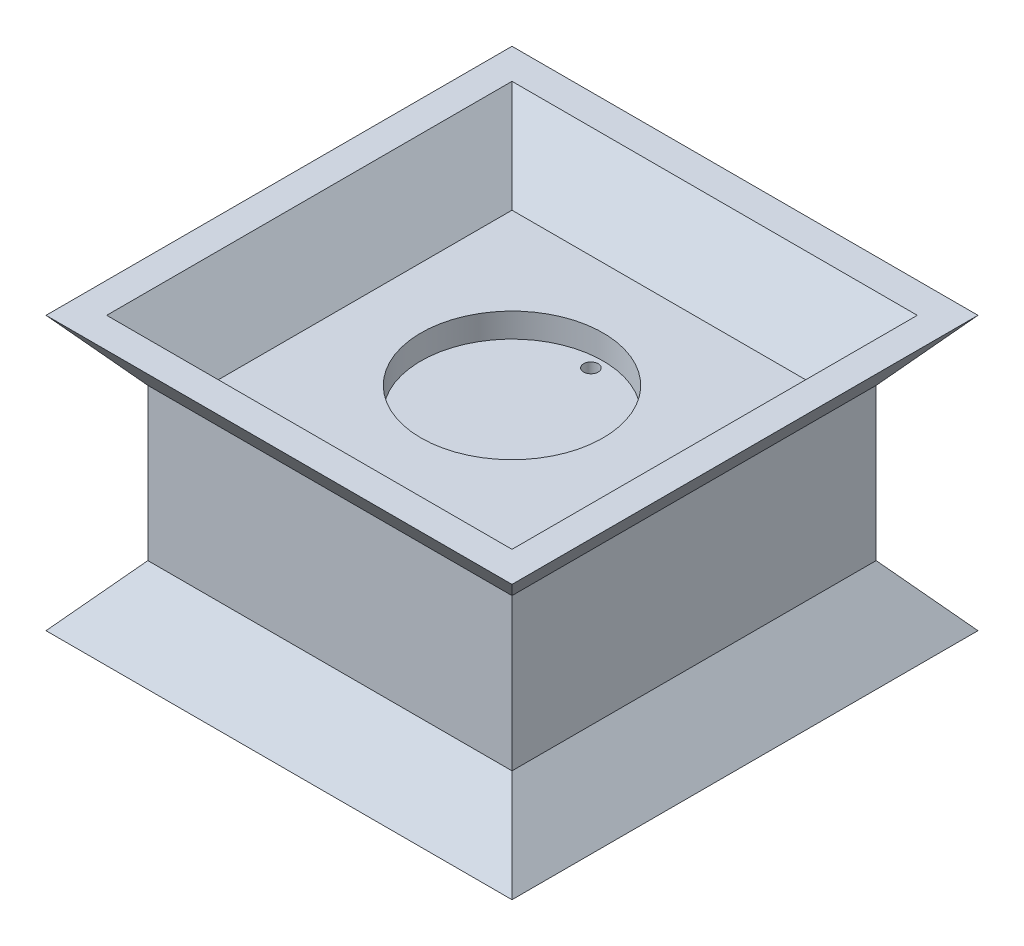
ISO-10303-21;
HEADER;
FILE_DESCRIPTION(('STEP AP214'),'2;1');
FILE_NAME('part.step','',(''),(''),'','','');
FILE_SCHEMA(('AUTOMOTIVE_DESIGN { 1 0 10303 214 1 1 1 1 }'));
ENDSEC;
DATA;
#1=APPLICATION_CONTEXT('core data for automotive mechanical design processes');
#2=APPLICATION_PROTOCOL_DEFINITION('international standard','automotive_design',2000,#1);
#3=PRODUCT_CONTEXT('',#1,'mechanical');
#4=PRODUCT('Part','Part','',(#3));
#5=PRODUCT_RELATED_PRODUCT_CATEGORY('part','',(#4));
#6=PRODUCT_DEFINITION_FORMATION('','',#4);
#7=PRODUCT_DEFINITION_CONTEXT('part definition',#1,'design');
#8=PRODUCT_DEFINITION('design','',#6,#7);
#9=PRODUCT_DEFINITION_SHAPE('','',#8);
#10=(LENGTH_UNIT() NAMED_UNIT(*) SI_UNIT(.MILLI.,.METRE.));
#11=(NAMED_UNIT(*) PLANE_ANGLE_UNIT() SI_UNIT($,.RADIAN.));
#12=(NAMED_UNIT(*) SI_UNIT($,.STERADIAN.) SOLID_ANGLE_UNIT());
#13=UNCERTAINTY_MEASURE_WITH_UNIT(LENGTH_MEASURE(1.E-05),#10,'distance_accuracy_value','');
#14=(GEOMETRIC_REPRESENTATION_CONTEXT(3) GLOBAL_UNCERTAINTY_ASSIGNED_CONTEXT((#13)) GLOBAL_UNIT_ASSIGNED_CONTEXT((#10,
#11,#12)) REPRESENTATION_CONTEXT('',''));
#15=CARTESIAN_POINT('',(0.,0.,0.));
#16=DIRECTION('',(0.,0.,1.));
#17=DIRECTION('',(1.,0.,0.));
#18=AXIS2_PLACEMENT_3D('',#15,#16,#17);
#19=CARTESIAN_POINT('',(38.1,15.875,38.1));
#20=DIRECTION('',(-1.,0.,0.));
#21=DIRECTION('',(0.,0.,1.));
#22=AXIS2_PLACEMENT_3D('',#19,#20,#21);
#23=PLANE('',#22);
#24=DIRECTION('',(0.,0.,-1.));
#25=VECTOR('',#24,1.);
#26=CARTESIAN_POINT('',(38.1,-15.875,38.1));
#27=LINE('',#26,#25);
#28=CARTESIAN_POINT('',(38.1,-15.875,38.1));
#29=VERTEX_POINT('',#28);
#30=CARTESIAN_POINT('',(38.1,-15.875,-38.1));
#31=VERTEX_POINT('',#30);
#32=EDGE_CURVE('E193',#29,#31,#27,.T.);
#33=ORIENTED_EDGE('',*,*,#32,.T.);
#34=DIRECTION('',(0.,-1.,0.));
#35=VECTOR('',#34,1.);
#36=CARTESIAN_POINT('',(38.1,15.875,-38.1));
#37=LINE('',#36,#35);
#38=CARTESIAN_POINT('',(38.1,15.875,-38.1));
#39=VERTEX_POINT('',#38);
#40=EDGE_CURVE('E11',#39,#31,#37,.T.);
#41=ORIENTED_EDGE('',*,*,#40,.F.);
#42=DIRECTION('',(0.,0.,-1.));
#43=VECTOR('',#42,1.);
#44=CARTESIAN_POINT('',(38.1,15.875,38.1));
#45=LINE('',#44,#43);
#46=CARTESIAN_POINT('',(38.1,15.875,38.1));
#47=VERTEX_POINT('',#46);
#48=EDGE_CURVE('E209',#47,#39,#45,.T.);
#49=ORIENTED_EDGE('',*,*,#48,.F.);
#50=DIRECTION('',(0.,-1.,0.));
#51=VECTOR('',#50,1.);
#52=CARTESIAN_POINT('',(38.1,15.875,38.1));
#53=LINE('',#52,#51);
#54=EDGE_CURVE('E222',#47,#29,#53,.T.);
#55=ORIENTED_EDGE('',*,*,#54,.T.);
#56=EDGE_LOOP('',(#33,#41,#49,#55));
#57=FACE_BOUND('',#56,.T.);
#58=ADVANCED_FACE('F32',(#57),#23,.F.);
#59=CARTESIAN_POINT('',(-38.1,15.875,-38.1));
#60=DIRECTION('',(0.,0.,1.));
#61=DIRECTION('',(1.,0.,0.));
#62=AXIS2_PLACEMENT_3D('',#59,#60,#61);
#63=PLANE('',#62);
#64=DIRECTION('',(-1.,0.,0.));
#65=VECTOR('',#64,1.);
#66=CARTESIAN_POINT('',(-38.1,-15.875,-38.1));
#67=LINE('',#66,#65);
#68=CARTESIAN_POINT('',(-38.1,-15.875,-38.1));
#69=VERTEX_POINT('',#68);
#70=EDGE_CURVE('E225',#31,#69,#67,.T.);
#71=ORIENTED_EDGE('',*,*,#70,.T.);
#72=DIRECTION('',(0.,-1.,0.));
#73=VECTOR('',#72,1.);
#74=CARTESIAN_POINT('',(-38.1,15.875,-38.1));
#75=LINE('',#74,#73);
#76=CARTESIAN_POINT('',(-38.1,15.875,-38.1));
#77=VERTEX_POINT('',#76);
#78=EDGE_CURVE('E39',#77,#69,#75,.T.);
#79=ORIENTED_EDGE('',*,*,#78,.F.);
#80=DIRECTION('',(-1.,0.,0.));
#81=VECTOR('',#80,1.);
#82=CARTESIAN_POINT('',(-38.1,15.875,-38.1));
#83=LINE('',#82,#81);
#84=EDGE_CURVE('E212',#39,#77,#83,.T.);
#85=ORIENTED_EDGE('',*,*,#84,.F.);
#86=ORIENTED_EDGE('',*,*,#40,.T.);
#87=EDGE_LOOP('',(#71,#79,#85,#86));
#88=FACE_BOUND('',#87,.T.);
#89=ADVANCED_FACE('F236',(#88),#63,.F.);
#90=CARTESIAN_POINT('',(-38.1,15.875,38.1));
#91=DIRECTION('',(1.,0.,0.));
#92=DIRECTION('',(0.,0.,-1.));
#93=AXIS2_PLACEMENT_3D('',#90,#91,#92);
#94=PLANE('',#93);
#95=DIRECTION('',(0.,0.,1.));
#96=VECTOR('',#95,1.);
#97=CARTESIAN_POINT('',(-38.1,-15.875,38.1));
#98=LINE('',#97,#96);
#99=CARTESIAN_POINT('',(-38.1,-15.875,38.1));
#100=VERTEX_POINT('',#99);
#101=EDGE_CURVE('E67',#69,#100,#98,.T.);
#102=ORIENTED_EDGE('',*,*,#101,.T.);
#103=DIRECTION('',(0.,-1.,0.));
#104=VECTOR('',#103,1.);
#105=CARTESIAN_POINT('',(-38.1,15.875,38.1));
#106=LINE('',#105,#104);
#107=CARTESIAN_POINT('',(-38.1,15.875,38.1));
#108=VERTEX_POINT('',#107);
#109=EDGE_CURVE('E55',#108,#100,#106,.T.);
#110=ORIENTED_EDGE('',*,*,#109,.F.);
#111=DIRECTION('',(0.,0.,1.));
#112=VECTOR('',#111,1.);
#113=CARTESIAN_POINT('',(-38.1,15.875,38.1));
#114=LINE('',#113,#112);
#115=EDGE_CURVE('E216',#77,#108,#114,.T.);
#116=ORIENTED_EDGE('',*,*,#115,.F.);
#117=ORIENTED_EDGE('',*,*,#78,.T.);
#118=EDGE_LOOP('',(#102,#110,#116,#117));
#119=FACE_BOUND('',#118,.T.);
#120=ADVANCED_FACE('F234',(#119),#94,.F.);
#121=CARTESIAN_POINT('',(-38.1,15.875,38.1));
#122=DIRECTION('',(0.,0.,-1.));
#123=DIRECTION('',(-1.,0.,0.));
#124=AXIS2_PLACEMENT_3D('',#121,#122,#123);
#125=PLANE('',#124);
#126=DIRECTION('',(1.,0.,0.));
#127=VECTOR('',#126,1.);
#128=CARTESIAN_POINT('',(-38.1,-15.875,38.1));
#129=LINE('',#128,#127);
#130=EDGE_CURVE('E213',#100,#29,#129,.T.);
#131=ORIENTED_EDGE('',*,*,#130,.T.);
#132=ORIENTED_EDGE('',*,*,#54,.F.);
#133=DIRECTION('',(1.,0.,0.));
#134=VECTOR('',#133,1.);
#135=CARTESIAN_POINT('',(-38.1,15.875,38.1));
#136=LINE('',#135,#134);
#137=EDGE_CURVE('E219',#108,#47,#136,.T.);
#138=ORIENTED_EDGE('',*,*,#137,.F.);
#139=ORIENTED_EDGE('',*,*,#109,.T.);
#140=EDGE_LOOP('',(#131,#132,#138,#139));
#141=FACE_BOUND('',#140,.T.);
#142=ADVANCED_FACE('F254',(#141),#125,.F.);
#143=CARTESIAN_POINT('',(-38.1,15.875,-38.1));
#144=DIRECTION('',(-0.766044443118977,-0.64278760968654,0.));
#145=DIRECTION('',(0.642787609686541,-0.766044443118977,0.));
#146=AXIS2_PLACEMENT_3D('',#143,#144,#145);
#147=PLANE('',#146);
#148=ORIENTED_EDGE('',*,*,#115,.T.);
#149=DIRECTION('',(0.540716203060937,-0.644400477571771,-0.540716203060937));
#150=VECTOR('',#149,1.);
#151=CARTESIAN_POINT('',(-38.1,15.875,38.1));
#152=LINE('',#151,#150);
#153=CARTESIAN_POINT('',(-48.7565653159515,28.575,48.7565653159515));
#154=VERTEX_POINT('',#153);
#155=EDGE_CURVE('E190',#154,#108,#152,.T.);
#156=ORIENTED_EDGE('',*,*,#155,.F.);
#157=DIRECTION('',(0.,0.,-1.));
#158=VECTOR('',#157,1.);
#159=CARTESIAN_POINT('',(-48.7565653159515,28.575,-38.1));
#160=LINE('',#159,#158);
#161=CARTESIAN_POINT('',(-48.7565653159515,28.575,-48.7565653159515));
#162=VERTEX_POINT('',#161);
#163=EDGE_CURVE('E172',#162,#154,#160,.F.);
#164=ORIENTED_EDGE('',*,*,#163,.F.);
#165=DIRECTION('',(0.540716203060937,-0.644400477571771,0.540716203060937));
#166=VECTOR('',#165,1.);
#167=CARTESIAN_POINT('',(-38.1,15.875,-38.1));
#168=LINE('',#167,#166);
#169=EDGE_CURVE('E195',#162,#77,#168,.T.);
#170=ORIENTED_EDGE('',*,*,#169,.T.);
#171=EDGE_LOOP('',(#148,#156,#164,#170));
#172=FACE_BOUND('',#171,.T.);
#173=ADVANCED_FACE('F266',(#172),#147,.T.);
#174=CARTESIAN_POINT('',(-38.1,15.875,38.1));
#175=DIRECTION('',(0.,-0.64278760968654,0.766044443118977));
#176=DIRECTION('',(0.,-0.766044443118977,-0.64278760968654));
#177=AXIS2_PLACEMENT_3D('',#174,#175,#176);
#178=PLANE('',#177);
#179=ORIENTED_EDGE('',*,*,#137,.T.);
#180=DIRECTION('',(-0.540716203060937,-0.644400477571771,-0.540716203060937));
#181=VECTOR('',#180,1.);
#182=CARTESIAN_POINT('',(15.821100266349,-10.6759587966246,15.8211002663491));
#183=LINE('',#182,#181);
#184=CARTESIAN_POINT('',(48.7565653159515,28.575,48.7565653159515));
#185=VERTEX_POINT('',#184);
#186=EDGE_CURVE('E194',#185,#47,#183,.T.);
#187=ORIENTED_EDGE('',*,*,#186,.F.);
#188=DIRECTION('',(-1.,0.,0.));
#189=VECTOR('',#188,1.);
#190=CARTESIAN_POINT('',(-38.1,28.575,48.7565653159515));
#191=LINE('',#190,#189);
#192=EDGE_CURVE('E204',#154,#185,#191,.F.);
#193=ORIENTED_EDGE('',*,*,#192,.F.);
#194=ORIENTED_EDGE('',*,*,#155,.T.);
#195=EDGE_LOOP('',(#179,#187,#193,#194));
#196=FACE_BOUND('',#195,.T.);
#197=ADVANCED_FACE('F268',(#196),#178,.T.);
#198=CARTESIAN_POINT('',(38.1,15.875,-38.1));
#199=DIRECTION('',(0.766044443118977,-0.64278760968654,0.));
#200=DIRECTION('',(0.642787609686541,0.766044443118977,0.));
#201=AXIS2_PLACEMENT_3D('',#198,#199,#200);
#202=PLANE('',#201);
#203=ORIENTED_EDGE('',*,*,#48,.T.);
#204=DIRECTION('',(-0.540716203060937,-0.644400477571771,0.540716203060937));
#205=VECTOR('',#204,1.);
#206=CARTESIAN_POINT('',(15.821100266349,-10.6759587966246,-15.8211002663491));
#207=LINE('',#206,#205);
#208=CARTESIAN_POINT('',(48.7565653159515,28.575,-48.7565653159515));
#209=VERTEX_POINT('',#208);
#210=EDGE_CURVE('E198',#209,#39,#207,.T.);
#211=ORIENTED_EDGE('',*,*,#210,.F.);
#212=DIRECTION('',(0.,0.,1.));
#213=VECTOR('',#212,1.);
#214=CARTESIAN_POINT('',(48.7565653159515,28.575,-38.1));
#215=LINE('',#214,#213);
#216=EDGE_CURVE('E206',#185,#209,#215,.F.);
#217=ORIENTED_EDGE('',*,*,#216,.F.);
#218=ORIENTED_EDGE('',*,*,#186,.T.);
#219=EDGE_LOOP('',(#203,#211,#217,#218));
#220=FACE_BOUND('',#219,.T.);
#221=ADVANCED_FACE('F258',(#220),#202,.T.);
#222=CARTESIAN_POINT('',(-38.1,15.875,-38.1));
#223=DIRECTION('',(0.,-0.64278760968654,-0.766044443118977));
#224=DIRECTION('',(0.,0.766044443118977,-0.64278760968654));
#225=AXIS2_PLACEMENT_3D('',#222,#223,#224);
#226=PLANE('',#225);
#227=ORIENTED_EDGE('',*,*,#84,.T.);
#228=ORIENTED_EDGE('',*,*,#169,.F.);
#229=DIRECTION('',(1.,0.,0.));
#230=VECTOR('',#229,1.);
#231=CARTESIAN_POINT('',(-38.1,28.575,-48.7565653159515));
#232=LINE('',#231,#230);
#233=EDGE_CURVE('E77',#209,#162,#232,.F.);
#234=ORIENTED_EDGE('',*,*,#233,.F.);
#235=ORIENTED_EDGE('',*,*,#210,.T.);
#236=EDGE_LOOP('',(#227,#228,#234,#235));
#237=FACE_BOUND('',#236,.T.);
#238=ADVANCED_FACE('F262',(#237),#226,.T.);
#239=CARTESIAN_POINT('',(0.,28.575,0.));
#240=DIRECTION('',(0.,1.,0.));
#241=DIRECTION('',(0.,0.,1.));
#242=AXIS2_PLACEMENT_3D('',#239,#240,#241);
#243=PLANE('',#242);
#244=DIRECTION('',(0.,0.,1.));
#245=VECTOR('',#244,1.);
#246=CARTESIAN_POINT('',(-42.4065653159515,28.575,42.4065653159515));
#247=LINE('',#246,#245);
#248=CARTESIAN_POINT('',(-42.4065653159515,28.575,-42.4065653159515));
#249=VERTEX_POINT('',#248);
#250=CARTESIAN_POINT('',(-42.4065653159515,28.575,42.4065653159515));
#251=VERTEX_POINT('',#250);
#252=EDGE_CURVE('E46',#249,#251,#247,.T.);
#253=ORIENTED_EDGE('',*,*,#252,.F.);
#254=DIRECTION('',(-1.,0.,0.));
#255=VECTOR('',#254,1.);
#256=CARTESIAN_POINT('',(42.4065653159515,28.575,-42.4065653159515));
#257=LINE('',#256,#255);
#258=CARTESIAN_POINT('',(42.4065653159515,28.575,-42.4065653159515));
#259=VERTEX_POINT('',#258);
#260=EDGE_CURVE('E151',#259,#249,#257,.T.);
#261=ORIENTED_EDGE('',*,*,#260,.F.);
#262=DIRECTION('',(0.,0.,-1.));
#263=VECTOR('',#262,1.);
#264=CARTESIAN_POINT('',(42.4065653159515,28.575,42.4065653159515));
#265=LINE('',#264,#263);
#266=CARTESIAN_POINT('',(42.4065653159515,28.575,42.4065653159515));
#267=VERTEX_POINT('',#266);
#268=EDGE_CURVE('E134',#267,#259,#265,.T.);
#269=ORIENTED_EDGE('',*,*,#268,.F.);
#270=DIRECTION('',(1.,0.,0.));
#271=VECTOR('',#270,1.);
#272=CARTESIAN_POINT('',(42.4065653159515,28.575,42.4065653159515));
#273=LINE('',#272,#271);
#274=EDGE_CURVE('E145',#251,#267,#273,.T.);
#275=ORIENTED_EDGE('',*,*,#274,.F.);
#276=EDGE_LOOP('',(#253,#261,#269,#275));
#277=FACE_BOUND('',#276,.T.);
#278=ORIENTED_EDGE('',*,*,#163,.T.);
#279=ORIENTED_EDGE('',*,*,#192,.T.);
#280=ORIENTED_EDGE('',*,*,#216,.T.);
#281=ORIENTED_EDGE('',*,*,#233,.T.);
#282=EDGE_LOOP('',(#278,#279,#280,#281));
#283=FACE_BOUND('',#282,.T.);
#284=ADVANCED_FACE('F149',(#277,#283),#243,.T.);
#285=CARTESIAN_POINT('',(-38.1,-15.875,-38.1));
#286=DIRECTION('',(-0.766044443118977,0.64278760968654,0.));
#287=DIRECTION('',(-0.642787609686541,-0.766044443118977,0.));
#288=AXIS2_PLACEMENT_3D('',#285,#286,#287);
#289=PLANE('',#288);
#290=ORIENTED_EDGE('',*,*,#101,.F.);
#291=DIRECTION('',(0.540716203060937,0.644400477571771,0.540716203060937));
#292=VECTOR('',#291,1.);
#293=CARTESIAN_POINT('',(-38.1,-15.875,-38.1));
#294=LINE('',#293,#292);
#295=CARTESIAN_POINT('',(-48.7565653159515,-28.575,-48.7565653159515));
#296=VERTEX_POINT('',#295);
#297=EDGE_CURVE('E170',#296,#69,#294,.T.);
#298=ORIENTED_EDGE('',*,*,#297,.F.);
#299=DIRECTION('',(0.,0.,1.));
#300=VECTOR('',#299,1.);
#301=CARTESIAN_POINT('',(-48.7565653159515,-28.575,-38.1));
#302=LINE('',#301,#300);
#303=CARTESIAN_POINT('',(-48.7565653159515,-28.575,48.7565653159515));
#304=VERTEX_POINT('',#303);
#305=EDGE_CURVE('E159',#296,#304,#302,.T.);
#306=ORIENTED_EDGE('',*,*,#305,.T.);
#307=DIRECTION('',(0.540716203060937,0.644400477571771,-0.540716203060937));
#308=VECTOR('',#307,1.);
#309=CARTESIAN_POINT('',(-15.8211002663491,10.6759587966246,15.8211002663491));
#310=LINE('',#309,#308);
#311=EDGE_CURVE('E174',#304,#100,#310,.T.);
#312=ORIENTED_EDGE('',*,*,#311,.T.);
#313=EDGE_LOOP('',(#290,#298,#306,#312));
#314=FACE_BOUND('',#313,.T.);
#315=ADVANCED_FACE('F243',(#314),#289,.T.);
#316=CARTESIAN_POINT('',(-38.1,-15.875,-38.1));
#317=DIRECTION('',(0.,0.64278760968654,-0.766044443118977));
#318=DIRECTION('',(0.,0.766044443118977,0.64278760968654));
#319=AXIS2_PLACEMENT_3D('',#316,#317,#318);
#320=PLANE('',#319);
#321=ORIENTED_EDGE('',*,*,#70,.F.);
#322=DIRECTION('',(-0.540716203060937,0.644400477571771,0.540716203060937));
#323=VECTOR('',#322,1.);
#324=CARTESIAN_POINT('',(38.1,-15.875,-38.1));
#325=LINE('',#324,#323);
#326=CARTESIAN_POINT('',(48.7565653159515,-28.575,-48.7565653159515));
#327=VERTEX_POINT('',#326);
#328=EDGE_CURVE('E173',#327,#31,#325,.T.);
#329=ORIENTED_EDGE('',*,*,#328,.F.);
#330=DIRECTION('',(-1.,0.,0.));
#331=VECTOR('',#330,1.);
#332=CARTESIAN_POINT('',(-38.1,-28.575,-48.7565653159515));
#333=LINE('',#332,#331);
#334=EDGE_CURVE('E182',#327,#296,#333,.T.);
#335=ORIENTED_EDGE('',*,*,#334,.T.);
#336=ORIENTED_EDGE('',*,*,#297,.T.);
#337=EDGE_LOOP('',(#321,#329,#335,#336));
#338=FACE_BOUND('',#337,.T.);
#339=ADVANCED_FACE('F240',(#338),#320,.T.);
#340=CARTESIAN_POINT('',(38.1,-15.875,-38.1));
#341=DIRECTION('',(0.766044443118977,0.64278760968654,0.));
#342=DIRECTION('',(-0.642787609686541,0.766044443118977,0.));
#343=AXIS2_PLACEMENT_3D('',#340,#341,#342);
#344=PLANE('',#343);
#345=ORIENTED_EDGE('',*,*,#32,.F.);
#346=DIRECTION('',(-0.540716203060937,0.644400477571771,-0.540716203060937));
#347=VECTOR('',#346,1.);
#348=CARTESIAN_POINT('',(15.821100266349,10.6759587966246,15.8211002663491));
#349=LINE('',#348,#347);
#350=CARTESIAN_POINT('',(48.7565653159515,-28.575,48.7565653159515));
#351=VERTEX_POINT('',#350);
#352=EDGE_CURVE('E176',#351,#29,#349,.T.);
#353=ORIENTED_EDGE('',*,*,#352,.F.);
#354=DIRECTION('',(0.,0.,-1.));
#355=VECTOR('',#354,1.);
#356=CARTESIAN_POINT('',(48.7565653159515,-28.575,-38.1));
#357=LINE('',#356,#355);
#358=EDGE_CURVE('E185',#351,#327,#357,.T.);
#359=ORIENTED_EDGE('',*,*,#358,.T.);
#360=ORIENTED_EDGE('',*,*,#328,.T.);
#361=EDGE_LOOP('',(#345,#353,#359,#360));
#362=FACE_BOUND('',#361,.T.);
#363=ADVANCED_FACE('F349',(#362),#344,.T.);
#364=CARTESIAN_POINT('',(-38.1,-15.875,38.1));
#365=DIRECTION('',(0.,0.64278760968654,0.766044443118977));
#366=DIRECTION('',(0.,-0.766044443118977,0.64278760968654));
#367=AXIS2_PLACEMENT_3D('',#364,#365,#366);
#368=PLANE('',#367);
#369=ORIENTED_EDGE('',*,*,#130,.F.);
#370=ORIENTED_EDGE('',*,*,#311,.F.);
#371=DIRECTION('',(1.,0.,0.));
#372=VECTOR('',#371,1.);
#373=CARTESIAN_POINT('',(-38.1,-28.575,48.7565653159515));
#374=LINE('',#373,#372);
#375=EDGE_CURVE('E177',#304,#351,#374,.T.);
#376=ORIENTED_EDGE('',*,*,#375,.T.);
#377=ORIENTED_EDGE('',*,*,#352,.T.);
#378=EDGE_LOOP('',(#369,#370,#376,#377));
#379=FACE_BOUND('',#378,.T.);
#380=ADVANCED_FACE('F250',(#379),#368,.T.);
#381=CARTESIAN_POINT('',(0.,-28.575,0.));
#382=DIRECTION('',(0.,-1.,0.));
#383=DIRECTION('',(0.,0.,1.));
#384=AXIS2_PLACEMENT_3D('',#381,#382,#383);
#385=PLANE('',#384);
#386=ORIENTED_EDGE('',*,*,#305,.F.);
#387=ORIENTED_EDGE('',*,*,#334,.F.);
#388=ORIENTED_EDGE('',*,*,#358,.F.);
#389=ORIENTED_EDGE('',*,*,#375,.F.);
#390=EDGE_LOOP('',(#386,#387,#388,#389));
#391=FACE_BOUND('',#390,.T.);
#392=ADVANCED_FACE('F246',(#391),#385,.T.);
#393=CARTESIAN_POINT('',(-42.4065653159515,28.575,42.4065653159515));
#394=DIRECTION('',(-0.766044443118977,-0.64278760968654,0.));
#395=DIRECTION('',(0.64278760968654,-0.766044443118977,0.));
#396=AXIS2_PLACEMENT_3D('',#393,#394,#395);
#397=PLANE('',#396);
#398=ORIENTED_EDGE('',*,*,#252,.T.);
#399=DIRECTION('',(-0.540716203060937,0.644400477571771,0.540716203060937));
#400=VECTOR('',#399,1.);
#401=CARTESIAN_POINT('',(-42.4065653159515,28.575,42.4065653159515));
#402=LINE('',#401,#400);
#403=CARTESIAN_POINT('',(-31.75,15.875,31.75));
#404=VERTEX_POINT('',#403);
#405=EDGE_CURVE('E142',#404,#251,#402,.T.);
#406=ORIENTED_EDGE('',*,*,#405,.F.);
#407=DIRECTION('',(0.,0.,1.));
#408=VECTOR('',#407,1.);
#409=CARTESIAN_POINT('',(-31.75,15.875,0.));
#410=LINE('',#409,#408);
#411=CARTESIAN_POINT('',(-31.75,15.875,-31.75));
#412=VERTEX_POINT('',#411);
#413=EDGE_CURVE('E153',#412,#404,#410,.T.);
#414=ORIENTED_EDGE('',*,*,#413,.F.);
#415=DIRECTION('',(-0.540716203060937,0.644400477571771,-0.540716203060937));
#416=VECTOR('',#415,1.);
#417=CARTESIAN_POINT('',(-17.609410021395,-0.977098908404153,-17.609410021395));
#418=LINE('',#417,#416);
#419=EDGE_CURVE('E157',#412,#249,#418,.T.);
#420=ORIENTED_EDGE('',*,*,#419,.T.);
#421=EDGE_LOOP('',(#398,#406,#414,#420));
#422=FACE_BOUND('',#421,.T.);
#423=ADVANCED_FACE('F368',(#422),#397,.F.);
#424=CARTESIAN_POINT('',(42.4065653159515,28.575,-42.4065653159515));
#425=DIRECTION('',(0.,-0.64278760968654,-0.766044443118977));
#426=DIRECTION('',(0.,0.766044443118977,-0.64278760968654));
#427=AXIS2_PLACEMENT_3D('',#424,#425,#426);
#428=PLANE('',#427);
#429=ORIENTED_EDGE('',*,*,#260,.T.);
#430=ORIENTED_EDGE('',*,*,#419,.F.);
#431=DIRECTION('',(-1.,0.,0.));
#432=VECTOR('',#431,1.);
#433=CARTESIAN_POINT('',(0.,15.875,-31.75));
#434=LINE('',#433,#432);
#435=CARTESIAN_POINT('',(31.75,15.875,-31.75));
#436=VERTEX_POINT('',#435);
#437=EDGE_CURVE('E160',#436,#412,#434,.T.);
#438=ORIENTED_EDGE('',*,*,#437,.F.);
#439=DIRECTION('',(0.540716203060937,0.644400477571771,-0.540716203060937));
#440=VECTOR('',#439,1.);
#441=CARTESIAN_POINT('',(17.609410021395,-0.97709890840416,-17.609410021395));
#442=LINE('',#441,#440);
#443=EDGE_CURVE('E141',#436,#259,#442,.T.);
#444=ORIENTED_EDGE('',*,*,#443,.T.);
#445=EDGE_LOOP('',(#429,#430,#438,#444));
#446=FACE_BOUND('',#445,.T.);
#447=ADVANCED_FACE('F374',(#446),#428,.F.);
#448=CARTESIAN_POINT('',(42.4065653159515,28.575,42.4065653159515));
#449=DIRECTION('',(0.766044443118977,-0.64278760968654,0.));
#450=DIRECTION('',(0.64278760968654,0.766044443118977,0.));
#451=AXIS2_PLACEMENT_3D('',#448,#449,#450);
#452=PLANE('',#451);
#453=ORIENTED_EDGE('',*,*,#268,.T.);
#454=ORIENTED_EDGE('',*,*,#443,.F.);
#455=DIRECTION('',(0.,0.,-1.));
#456=VECTOR('',#455,1.);
#457=CARTESIAN_POINT('',(31.75,15.875,0.));
#458=LINE('',#457,#456);
#459=CARTESIAN_POINT('',(31.75,15.875,31.75));
#460=VERTEX_POINT('',#459);
#461=EDGE_CURVE('E137',#460,#436,#458,.T.);
#462=ORIENTED_EDGE('',*,*,#461,.F.);
#463=DIRECTION('',(0.540716203060937,0.644400477571771,0.540716203060937));
#464=VECTOR('',#463,1.);
#465=CARTESIAN_POINT('',(42.4065653159515,28.575,42.4065653159515));
#466=LINE('',#465,#464);
#467=EDGE_CURVE('E130',#460,#267,#466,.T.);
#468=ORIENTED_EDGE('',*,*,#467,.T.);
#469=EDGE_LOOP('',(#453,#454,#462,#468));
#470=FACE_BOUND('',#469,.T.);
#471=ADVANCED_FACE('F132',(#470),#452,.F.);
#472=CARTESIAN_POINT('',(42.4065653159515,28.575,42.4065653159515));
#473=DIRECTION('',(0.,-0.64278760968654,0.766044443118977));
#474=DIRECTION('',(0.,-0.766044443118977,-0.64278760968654));
#475=AXIS2_PLACEMENT_3D('',#472,#473,#474);
#476=PLANE('',#475);
#477=ORIENTED_EDGE('',*,*,#274,.T.);
#478=ORIENTED_EDGE('',*,*,#467,.F.);
#479=DIRECTION('',(1.,0.,0.));
#480=VECTOR('',#479,1.);
#481=CARTESIAN_POINT('',(0.,15.875,31.75));
#482=LINE('',#481,#480);
#483=EDGE_CURVE('E165',#404,#460,#482,.T.);
#484=ORIENTED_EDGE('',*,*,#483,.F.);
#485=ORIENTED_EDGE('',*,*,#405,.T.);
#486=EDGE_LOOP('',(#477,#478,#484,#485));
#487=FACE_BOUND('',#486,.T.);
#488=ADVANCED_FACE('F146',(#487),#476,.F.);
#489=CARTESIAN_POINT('',(0.,15.875,0.));
#490=DIRECTION('',(0.,1.,0.));
#491=DIRECTION('',(0.,0.,1.));
#492=AXIS2_PLACEMENT_3D('',#489,#490,#491);
#493=PLANE('',#492);
#494=CARTESIAN_POINT('',(0.,15.875,0.));
#495=DIRECTION('',(0.,1.,0.));
#496=DIRECTION('',(0.,0.,1.));
#497=AXIS2_PLACEMENT_3D('',#494,#495,#496);
#498=CIRCLE('',#497,19.05);
#499=CARTESIAN_POINT('',(0.,15.875,19.05));
#500=VERTEX_POINT('',#499);
#501=EDGE_CURVE('E469',#500,#500,#498,.T.);
#502=ORIENTED_EDGE('',*,*,#501,.F.);
#503=EDGE_LOOP('',(#502));
#504=FACE_BOUND('',#503,.T.);
#505=ORIENTED_EDGE('',*,*,#413,.T.);
#506=ORIENTED_EDGE('',*,*,#483,.T.);
#507=ORIENTED_EDGE('',*,*,#461,.T.);
#508=ORIENTED_EDGE('',*,*,#437,.T.);
#509=EDGE_LOOP('',(#505,#506,#507,#508));
#510=FACE_BOUND('',#509,.T.);
#511=ADVANCED_FACE('F394',(#504,#510),#493,.T.);
#512=CARTESIAN_POINT('',(0.,10.795,0.));
#513=DIRECTION('',(0.,1.,0.));
#514=DIRECTION('',(0.,0.,1.));
#515=AXIS2_PLACEMENT_3D('',#512,#513,#514);
#516=CYLINDRICAL_SURFACE('',#515,19.05);
#517=CARTESIAN_POINT('',(0.,10.795,0.));
#518=DIRECTION('',(0.,1.,0.));
#519=DIRECTION('',(0.,0.,1.));
#520=AXIS2_PLACEMENT_3D('',#517,#518,#519);
#521=CIRCLE('',#520,19.05);
#522=CARTESIAN_POINT('',(0.,10.795,19.05));
#523=VERTEX_POINT('',#522);
#524=EDGE_CURVE('E473',#523,#523,#521,.T.);
#525=ORIENTED_EDGE('',*,*,#524,.F.);
#526=EDGE_LOOP('',(#525));
#527=FACE_BOUND('',#526,.T.);
#528=ORIENTED_EDGE('',*,*,#501,.T.);
#529=EDGE_LOOP('',(#528));
#530=FACE_BOUND('',#529,.T.);
#531=ADVANCED_FACE('F401',(#527,#530),#516,.F.);
#532=CARTESIAN_POINT('',(0.,10.795,0.));
#533=DIRECTION('',(0.,1.,0.));
#534=DIRECTION('',(0.,0.,1.));
#535=AXIS2_PLACEMENT_3D('',#532,#533,#534);
#536=PLANE('',#535);
#537=CARTESIAN_POINT('',(0.,10.795,-16.51));
#538=DIRECTION('',(0.,1.,0.));
#539=DIRECTION('',(0.,0.,1.));
#540=AXIS2_PLACEMENT_3D('',#537,#538,#539);
#541=CIRCLE('',#540,1.524);
#542=CARTESIAN_POINT('',(0.,10.795,-14.986));
#543=VERTEX_POINT('',#542);
#544=EDGE_CURVE('E470',#543,#543,#541,.T.);
#545=ORIENTED_EDGE('',*,*,#544,.F.);
#546=EDGE_LOOP('',(#545));
#547=FACE_BOUND('',#546,.T.);
#548=ORIENTED_EDGE('',*,*,#524,.T.);
#549=EDGE_LOOP('',(#548));
#550=FACE_BOUND('',#549,.T.);
#551=ADVANCED_FACE('F409',(#547,#550),#536,.T.);
#552=CARTESIAN_POINT('',(0.,-9.525,-16.51));
#553=DIRECTION('',(0.,1.,0.));
#554=DIRECTION('',(0.,0.,1.));
#555=AXIS2_PLACEMENT_3D('',#552,#553,#554);
#556=CYLINDRICAL_SURFACE('',#555,1.524);
#557=CARTESIAN_POINT('',(0.,-9.525,-16.51));
#558=DIRECTION('',(0.,1.,0.));
#559=DIRECTION('',(0.,0.,1.));
#560=AXIS2_PLACEMENT_3D('',#557,#558,#559);
#561=CIRCLE('',#560,1.524);
#562=CARTESIAN_POINT('',(0.,-9.525,-14.986));
#563=VERTEX_POINT('',#562);
#564=EDGE_CURVE('E468',#563,#563,#561,.T.);
#565=ORIENTED_EDGE('',*,*,#564,.F.);
#566=EDGE_LOOP('',(#565));
#567=FACE_BOUND('',#566,.T.);
#568=ORIENTED_EDGE('',*,*,#544,.T.);
#569=EDGE_LOOP('',(#568));
#570=FACE_BOUND('',#569,.T.);
#571=ADVANCED_FACE('F417',(#567,#570),#556,.F.);
#572=CARTESIAN_POINT('',(0.,-9.525,-16.51));
#573=DIRECTION('',(0.,1.,0.));
#574=DIRECTION('',(0.,0.,1.));
#575=AXIS2_PLACEMENT_3D('',#572,#573,#574);
#576=PLANE('',#575);
#577=ORIENTED_EDGE('',*,*,#564,.T.);
#578=EDGE_LOOP('',(#577));
#579=FACE_BOUND('',#578,.T.);
#580=ADVANCED_FACE('F425',(#579),#576,.T.);
#581=CLOSED_SHELL('',(#58,#89,#120,#142,#173,#197,#221,#238,#284,#315,#339,#363,#380,#392,#423,
#447,#471,#488,#511,#531,#551,#571,#580));
#582=MANIFOLD_SOLID_BREP('B2',#581);
#583=ADVANCED_BREP_SHAPE_REPRESENTATION('',(#18,#582),#14);
#584=SHAPE_DEFINITION_REPRESENTATION(#9,#583);
ENDSEC;
END-ISO-10303-21;
